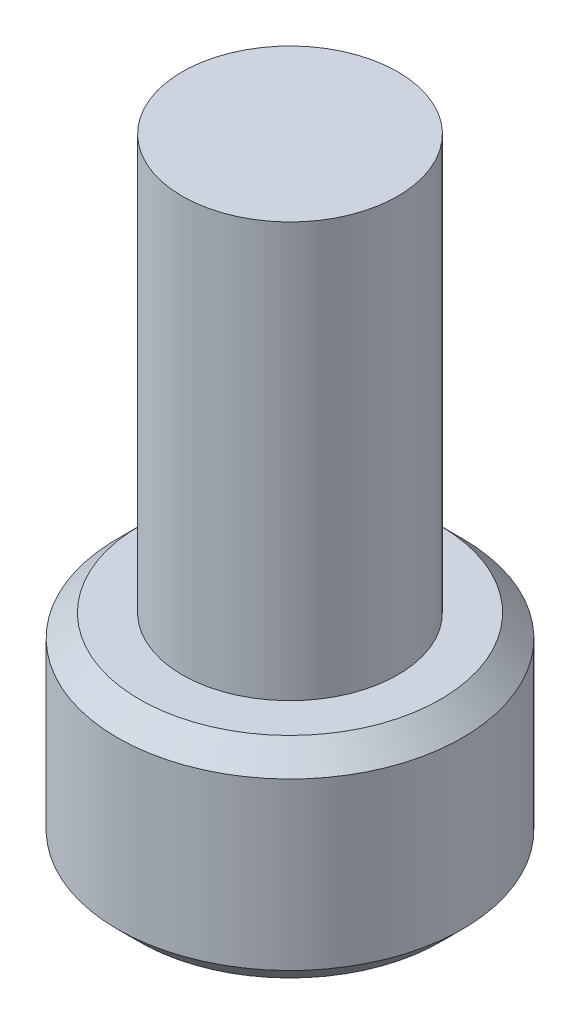
ISO-10303-21;
HEADER;
FILE_DESCRIPTION(('STEP AP214'),'2;1');
FILE_NAME('part.step','',(''),(''),'','','');
FILE_SCHEMA(('AUTOMOTIVE_DESIGN { 1 0 10303 214 1 1 1 1 }'));
ENDSEC;
DATA;
#1=APPLICATION_CONTEXT('core data for automotive mechanical design processes');
#2=APPLICATION_PROTOCOL_DEFINITION('international standard','automotive_design',2000,#1);
#3=PRODUCT_CONTEXT('',#1,'mechanical');
#4=PRODUCT('Part','Part','',(#3));
#5=PRODUCT_RELATED_PRODUCT_CATEGORY('part','',(#4));
#6=PRODUCT_DEFINITION_FORMATION('','',#4);
#7=PRODUCT_DEFINITION_CONTEXT('part definition',#1,'design');
#8=PRODUCT_DEFINITION('design','',#6,#7);
#9=PRODUCT_DEFINITION_SHAPE('','',#8);
#10=(LENGTH_UNIT() NAMED_UNIT(*) SI_UNIT(.MILLI.,.METRE.));
#11=(NAMED_UNIT(*) PLANE_ANGLE_UNIT() SI_UNIT($,.RADIAN.));
#12=(NAMED_UNIT(*) SI_UNIT($,.STERADIAN.) SOLID_ANGLE_UNIT());
#13=UNCERTAINTY_MEASURE_WITH_UNIT(LENGTH_MEASURE(1.E-05),#10,'distance_accuracy_value','');
#14=(GEOMETRIC_REPRESENTATION_CONTEXT(3) GLOBAL_UNCERTAINTY_ASSIGNED_CONTEXT((#13)) GLOBAL_UNIT_ASSIGNED_CONTEXT((#10,
#11,#12)) REPRESENTATION_CONTEXT('',''));
#15=CARTESIAN_POINT('',(0.,0.,0.));
#16=DIRECTION('',(0.,0.,1.));
#17=DIRECTION('',(1.,0.,0.));
#18=AXIS2_PLACEMENT_3D('',#15,#16,#17);
#19=CARTESIAN_POINT('',(0.,9.525,0.));
#20=DIRECTION('',(0.,-1.,0.));
#21=DIRECTION('',(0.,0.,-1.));
#22=AXIS2_PLACEMENT_3D('',#19,#20,#21);
#23=CYLINDRICAL_SURFACE('',#22,2.4765);
#24=CARTESIAN_POINT('',(0.,9.525,0.));
#25=DIRECTION('',(0.,1.,0.));
#26=DIRECTION('',(0.,0.,1.));
#27=AXIS2_PLACEMENT_3D('',#24,#25,#26);
#28=CIRCLE('',#27,2.4765);
#29=CARTESIAN_POINT('',(0.,9.525,-2.4765));
#30=VERTEX_POINT('',#29);
#31=EDGE_CURVE('E173',#30,#30,#28,.T.);
#32=CARTESIAN_POINT('',(0.,0.,0.));
#33=DIRECTION('',(0.,1.,0.));
#34=DIRECTION('',(0.,0.,1.));
#35=AXIS2_PLACEMENT_3D('',#32,#33,#34);
#36=CIRCLE('',#35,2.4765);
#37=CARTESIAN_POINT('',(0.,0.,-2.4765));
#38=VERTEX_POINT('',#37);
#39=EDGE_CURVE('E163',#38,#38,#36,.T.);
#40=CARTESIAN_POINT('',(0.,9.525,-2.4765));
#41=CARTESIAN_POINT('',(0.,9.42578125,-2.4765));
#42=CARTESIAN_POINT('',(0.,9.3265625,-2.4765));
#43=CARTESIAN_POINT('',(0.,9.128125,-2.4765));
#44=CARTESIAN_POINT('',(0.,9.02890625,-2.4765));
#45=CARTESIAN_POINT('',(0.,8.83046875,-2.4765));
#46=CARTESIAN_POINT('',(0.,8.73125,-2.4765));
#47=CARTESIAN_POINT('',(0.,8.5328125,-2.4765));
#48=CARTESIAN_POINT('',(0.,8.43359375,-2.4765));
#49=CARTESIAN_POINT('',(0.,8.23515625,-2.4765));
#50=CARTESIAN_POINT('',(0.,8.1359375,-2.4765));
#51=CARTESIAN_POINT('',(0.,7.9375,-2.4765));
#52=CARTESIAN_POINT('',(0.,7.83828125,-2.4765));
#53=CARTESIAN_POINT('',(0.,7.63984375,-2.4765));
#54=CARTESIAN_POINT('',(0.,7.540625,-2.4765));
#55=CARTESIAN_POINT('',(0.,7.3421875,-2.4765));
#56=CARTESIAN_POINT('',(0.,7.24296875,-2.4765));
#57=CARTESIAN_POINT('',(0.,7.04453125,-2.4765));
#58=CARTESIAN_POINT('',(0.,6.9453125,-2.4765));
#59=CARTESIAN_POINT('',(0.,6.746875,-2.4765));
#60=CARTESIAN_POINT('',(0.,6.64765625,-2.4765));
#61=CARTESIAN_POINT('',(0.,6.44921875,-2.4765));
#62=CARTESIAN_POINT('',(0.,6.35,-2.4765));
#63=CARTESIAN_POINT('',(0.,6.1515625,-2.4765));
#64=CARTESIAN_POINT('',(0.,6.05234375,-2.4765));
#65=CARTESIAN_POINT('',(0.,5.85390625,-2.4765));
#66=CARTESIAN_POINT('',(0.,5.7546875,-2.4765));
#67=CARTESIAN_POINT('',(0.,5.55625,-2.4765));
#68=CARTESIAN_POINT('',(0.,5.45703125,-2.4765));
#69=CARTESIAN_POINT('',(0.,5.25859375,-2.4765));
#70=CARTESIAN_POINT('',(0.,5.159375,-2.4765));
#71=CARTESIAN_POINT('',(0.,4.9609375,-2.4765));
#72=CARTESIAN_POINT('',(0.,4.86171875,-2.4765));
#73=CARTESIAN_POINT('',(0.,4.66328125,-2.4765));
#74=CARTESIAN_POINT('',(0.,4.5640625,-2.4765));
#75=CARTESIAN_POINT('',(0.,4.365625,-2.4765));
#76=CARTESIAN_POINT('',(0.,4.26640625,-2.4765));
#77=CARTESIAN_POINT('',(0.,4.06796875,-2.4765));
#78=CARTESIAN_POINT('',(0.,3.96875,-2.4765));
#79=CARTESIAN_POINT('',(0.,3.7703125,-2.4765));
#80=CARTESIAN_POINT('',(0.,3.67109375,-2.4765));
#81=CARTESIAN_POINT('',(0.,3.47265625,-2.4765));
#82=CARTESIAN_POINT('',(0.,3.3734375,-2.4765));
#83=CARTESIAN_POINT('',(0.,3.175,-2.4765));
#84=CARTESIAN_POINT('',(0.,3.07578125,-2.4765));
#85=CARTESIAN_POINT('',(0.,2.87734375,-2.4765));
#86=CARTESIAN_POINT('',(0.,2.778125,-2.4765));
#87=CARTESIAN_POINT('',(0.,2.5796875,-2.4765));
#88=CARTESIAN_POINT('',(0.,2.48046875,-2.4765));
#89=CARTESIAN_POINT('',(0.,2.28203125,-2.4765));
#90=CARTESIAN_POINT('',(0.,2.1828125,-2.4765));
#91=CARTESIAN_POINT('',(0.,1.984375,-2.4765));
#92=CARTESIAN_POINT('',(0.,1.88515625,-2.4765));
#93=CARTESIAN_POINT('',(0.,1.68671875,-2.4765));
#94=CARTESIAN_POINT('',(0.,1.5875,-2.4765));
#95=CARTESIAN_POINT('',(0.,1.3890625,-2.4765));
#96=CARTESIAN_POINT('',(0.,1.28984375,-2.4765));
#97=CARTESIAN_POINT('',(0.,1.09140625,-2.4765));
#98=CARTESIAN_POINT('',(0.,0.992187500000001,-2.4765));
#99=CARTESIAN_POINT('',(0.,0.793750000000001,-2.4765));
#100=CARTESIAN_POINT('',(0.,0.69453125,-2.4765));
#101=CARTESIAN_POINT('',(0.,0.49609375,-2.4765));
#102=CARTESIAN_POINT('',(0.,0.396875,-2.4765));
#103=CARTESIAN_POINT('',(0.,0.1984375,-2.4765));
#104=CARTESIAN_POINT('',(0.,0.0992187500000001,-2.4765));
#105=CARTESIAN_POINT('',(0.,0.,-2.4765));
#106=B_SPLINE_CURVE_WITH_KNOTS('',3,(#40,#41,#42,#43,#44,#45,#46,#47,#48,#49,#50,#51,#52,#53,
#54,#55,#56,#57,#58,#59,#60,#61,#62,#63,#64,#65,#66,#67,#68,#69,#70,#71,#72,#73,#74,#75,#76,#77,
#78,#79,#80,#81,#82,#83,#84,#85,#86,#87,#88,#89,#90,#91,#92,#93,#94,#95,#96,#97,#98,#99,#100,
#101,#102,#103,#104,#105),.UNSPECIFIED.,.F.,.F.,(4,2,2,2,2,2,2,2,2,2,2,2,2,2,2,2,2,2,2,2,2,2,2,
2,2,2,2,2,2,2,2,2,4),(0.,0.297656249999998,0.595312499999999,0.892968749999999,1.190625,
1.48828125,1.7859375,2.08359375,2.38125,2.67890625,2.9765625,3.27421875,3.571875,3.86953125,
4.1671875,4.46484375,4.7625,5.06015625,5.3578125,5.65546875,5.953125,6.25078125,6.5484375,
6.84609375,7.14375,7.44140625,7.7390625,8.03671875,8.334375,8.63203125,8.9296875,9.22734375,
9.525),.UNSPECIFIED.);
#107=EDGE_CURVE('BSEAM47',#30,#38,#106,.T.);
#108=ORIENTED_EDGE('',*,*,#31,.F.);
#109=ORIENTED_EDGE('',*,*,#39,.T.);
#110=ORIENTED_EDGE('',*,*,#107,.T.);
#111=ORIENTED_EDGE('',*,*,#107,.F.);
#112=EDGE_LOOP('',(#108,#110,#109,#111));
#113=FACE_BOUND('',#112,.T.);
#114=ADVANCED_FACE('F47',(#113),#23,.T.);
#115=CARTESIAN_POINT('',(0.,9.525,0.));
#116=DIRECTION('',(0.,1.,0.));
#117=DIRECTION('',(0.,0.,1.));
#118=AXIS2_PLACEMENT_3D('',#115,#116,#117);
#119=PLANE('',#118);
#120=ORIENTED_EDGE('',*,*,#31,.T.);
#121=EDGE_LOOP('',(#120));
#122=FACE_BOUND('',#121,.T.);
#123=ADVANCED_FACE('F203',(#122),#119,.T.);
#124=CARTESIAN_POINT('',(0.,-4.826,0.));
#125=DIRECTION('',(0.,1.,0.));
#126=DIRECTION('',(0.,0.,1.));
#127=AXIS2_PLACEMENT_3D('',#124,#125,#126);
#128=CYLINDRICAL_SURFACE('',#127,3.9624);
#129=CARTESIAN_POINT('',(0.,-0.508,0.));
#130=DIRECTION('',(0.,-1.,0.));
#131=DIRECTION('',(0.,0.,-1.));
#132=AXIS2_PLACEMENT_3D('',#129,#130,#131);
#133=CIRCLE('',#132,3.9624);
#134=CARTESIAN_POINT('',(0.,-0.508,-3.9624));
#135=VERTEX_POINT('',#134);
#136=EDGE_CURVE('E184',#135,#135,#133,.T.);
#137=ORIENTED_EDGE('',*,*,#136,.T.);
#138=EDGE_LOOP('',(#137));
#139=FACE_BOUND('',#138,.T.);
#140=CARTESIAN_POINT('',(0.,-4.318,0.));
#141=DIRECTION('',(0.,-1.,0.));
#142=DIRECTION('',(0.,0.,-1.));
#143=AXIS2_PLACEMENT_3D('',#140,#141,#142);
#144=CIRCLE('',#143,3.9624);
#145=CARTESIAN_POINT('',(0.,-4.318,-3.9624));
#146=VERTEX_POINT('',#145);
#147=EDGE_CURVE('E177',#146,#146,#144,.F.);
#148=ORIENTED_EDGE('',*,*,#147,.T.);
#149=EDGE_LOOP('',(#148));
#150=FACE_BOUND('',#149,.T.);
#151=ADVANCED_FACE('F199',(#139,#150),#128,.T.);
#152=CARTESIAN_POINT('',(0.,-4.826,0.));
#153=DIRECTION('',(0.,-1.,0.));
#154=DIRECTION('',(0.,0.,-1.));
#155=AXIS2_PLACEMENT_3D('',#152,#153,#154);
#156=PLANE('',#155);
#157=CARTESIAN_POINT('',(0.,-4.826,0.));
#158=DIRECTION('',(0.,-1.,0.));
#159=DIRECTION('',(0.,0.,-1.));
#160=AXIS2_PLACEMENT_3D('',#157,#158,#159);
#161=CIRCLE('',#160,3.4544);
#162=CARTESIAN_POINT('',(0.,-4.826,-3.4544));
#163=VERTEX_POINT('',#162);
#164=EDGE_CURVE('E11',#163,#163,#161,.T.);
#165=ORIENTED_EDGE('',*,*,#164,.T.);
#166=EDGE_LOOP('',(#165));
#167=FACE_BOUND('',#166,.T.);
#168=DIRECTION('',(0.5,0.,0.866025403784439));
#169=VECTOR('',#168,1.);
#170=CARTESIAN_POINT('',(1.14567944042316,-4.826,-1.984375));
#171=LINE('',#170,#169);
#172=CARTESIAN_POINT('',(1.14567944042316,-4.826,-1.984375));
#173=VERTEX_POINT('',#172);
#174=CARTESIAN_POINT('',(2.29135888084633,-4.826,0.));
#175=VERTEX_POINT('',#174);
#176=EDGE_CURVE('E64',#173,#175,#171,.T.);
#177=ORIENTED_EDGE('',*,*,#176,.F.);
#178=DIRECTION('',(1.,0.,0.));
#179=VECTOR('',#178,1.);
#180=CARTESIAN_POINT('',(-1.14567944042316,-4.826,-1.984375));
#181=LINE('',#180,#179);
#182=CARTESIAN_POINT('',(-1.14567944042316,-4.826,-1.984375));
#183=VERTEX_POINT('',#182);
#184=EDGE_CURVE('E157',#183,#173,#181,.T.);
#185=ORIENTED_EDGE('',*,*,#184,.F.);
#186=DIRECTION('',(0.5,0.,-0.866025403784439));
#187=VECTOR('',#186,1.);
#188=CARTESIAN_POINT('',(-2.29135888084633,-4.826,0.));
#189=LINE('',#188,#187);
#190=CARTESIAN_POINT('',(-2.29135888084633,-4.826,0.));
#191=VERTEX_POINT('',#190);
#192=EDGE_CURVE('E154',#191,#183,#189,.T.);
#193=ORIENTED_EDGE('',*,*,#192,.F.);
#194=DIRECTION('',(-0.5,0.,-0.866025403784439));
#195=VECTOR('',#194,1.);
#196=CARTESIAN_POINT('',(-1.14567944042316,-4.826,1.984375));
#197=LINE('',#196,#195);
#198=CARTESIAN_POINT('',(-1.14567944042316,-4.826,1.984375));
#199=VERTEX_POINT('',#198);
#200=EDGE_CURVE('E112',#199,#191,#197,.T.);
#201=ORIENTED_EDGE('',*,*,#200,.F.);
#202=DIRECTION('',(-1.,0.,0.));
#203=VECTOR('',#202,1.);
#204=CARTESIAN_POINT('',(1.14567944042316,-4.826,1.984375));
#205=LINE('',#204,#203);
#206=CARTESIAN_POINT('',(1.14567944042316,-4.826,1.984375));
#207=VERTEX_POINT('',#206);
#208=EDGE_CURVE('E148',#207,#199,#205,.T.);
#209=ORIENTED_EDGE('',*,*,#208,.F.);
#210=DIRECTION('',(-0.5,0.,0.866025403784439));
#211=VECTOR('',#210,1.);
#212=CARTESIAN_POINT('',(2.29135888084633,-4.826,0.));
#213=LINE('',#212,#211);
#214=EDGE_CURVE('E144',#175,#207,#213,.T.);
#215=ORIENTED_EDGE('',*,*,#214,.F.);
#216=EDGE_LOOP('',(#177,#185,#193,#201,#209,#215));
#217=FACE_BOUND('',#216,.T.);
#218=ADVANCED_FACE('F202',(#167,#217),#156,.T.);
#219=CARTESIAN_POINT('',(0.,0.,0.));
#220=DIRECTION('',(0.,-1.,0.));
#221=DIRECTION('',(0.,0.,-1.));
#222=AXIS2_PLACEMENT_3D('',#219,#220,#221);
#223=PLANE('',#222);
#224=CARTESIAN_POINT('',(0.,0.,0.));
#225=DIRECTION('',(0.,-1.,0.));
#226=DIRECTION('',(0.,0.,-1.));
#227=AXIS2_PLACEMENT_3D('',#224,#225,#226);
#228=CIRCLE('',#227,3.4544);
#229=CARTESIAN_POINT('',(0.,0.,-3.4544));
#230=VERTEX_POINT('',#229);
#231=EDGE_CURVE('E57',#230,#230,#228,.F.);
#232=ORIENTED_EDGE('',*,*,#231,.T.);
#233=EDGE_LOOP('',(#232));
#234=FACE_BOUND('',#233,.T.);
#235=ORIENTED_EDGE('',*,*,#39,.F.);
#236=EDGE_LOOP('',(#235));
#237=FACE_BOUND('',#236,.T.);
#238=ADVANCED_FACE('F191',(#234,#237),#223,.F.);
#239=CARTESIAN_POINT('',(1.14567944042316,-2.54,-1.984375));
#240=DIRECTION('',(0.866025403784439,0.,-0.5));
#241=DIRECTION('',(-0.5,0.,-0.866025403784439));
#242=AXIS2_PLACEMENT_3D('',#239,#240,#241);
#243=PLANE('',#242);
#244=ORIENTED_EDGE('',*,*,#176,.T.);
#245=DIRECTION('',(0.,-1.,0.));
#246=VECTOR('',#245,1.);
#247=CARTESIAN_POINT('',(2.29135888084633,-2.54,0.));
#248=LINE('',#247,#246);
#249=CARTESIAN_POINT('',(2.29135888084633,-2.54,0.));
#250=VERTEX_POINT('',#249);
#251=EDGE_CURVE('E94',#250,#175,#248,.T.);
#252=ORIENTED_EDGE('',*,*,#251,.F.);
#253=DIRECTION('',(0.5,0.,0.866025403784439));
#254=VECTOR('',#253,1.);
#255=CARTESIAN_POINT('',(1.14567944042316,-2.54,-1.984375));
#256=LINE('',#255,#254);
#257=CARTESIAN_POINT('',(1.14567944042316,-2.54,-1.984375));
#258=VERTEX_POINT('',#257);
#259=EDGE_CURVE('E160',#258,#250,#256,.T.);
#260=ORIENTED_EDGE('',*,*,#259,.F.);
#261=DIRECTION('',(0.,-1.,0.));
#262=VECTOR('',#261,1.);
#263=CARTESIAN_POINT('',(1.14567944042316,-2.54,-1.984375));
#264=LINE('',#263,#262);
#265=EDGE_CURVE('E72',#258,#173,#264,.T.);
#266=ORIENTED_EDGE('',*,*,#265,.T.);
#267=EDGE_LOOP('',(#244,#252,#260,#266));
#268=FACE_BOUND('',#267,.T.);
#269=ADVANCED_FACE('F222',(#268),#243,.F.);
#270=CARTESIAN_POINT('',(-1.14567944042316,-2.54,-1.984375));
#271=DIRECTION('',(0.,0.,-1.));
#272=DIRECTION('',(-1.,0.,0.));
#273=AXIS2_PLACEMENT_3D('',#270,#271,#272);
#274=PLANE('',#273);
#275=ORIENTED_EDGE('',*,*,#184,.T.);
#276=ORIENTED_EDGE('',*,*,#265,.F.);
#277=DIRECTION('',(1.,0.,0.));
#278=VECTOR('',#277,1.);
#279=CARTESIAN_POINT('',(-1.14567944042316,-2.54,-1.984375));
#280=LINE('',#279,#278);
#281=CARTESIAN_POINT('',(-1.14567944042316,-2.54,-1.984375));
#282=VERTEX_POINT('',#281);
#283=EDGE_CURVE('E126',#282,#258,#280,.T.);
#284=ORIENTED_EDGE('',*,*,#283,.F.);
#285=DIRECTION('',(0.,-1.,0.));
#286=VECTOR('',#285,1.);
#287=CARTESIAN_POINT('',(-1.14567944042316,-2.54,-1.984375));
#288=LINE('',#287,#286);
#289=EDGE_CURVE('E117',#282,#183,#288,.T.);
#290=ORIENTED_EDGE('',*,*,#289,.T.);
#291=EDGE_LOOP('',(#275,#276,#284,#290));
#292=FACE_BOUND('',#291,.T.);
#293=ADVANCED_FACE('F224',(#292),#274,.F.);
#294=CARTESIAN_POINT('',(-2.29135888084633,-2.54,0.));
#295=DIRECTION('',(-0.866025403784439,0.,-0.5));
#296=DIRECTION('',(-0.5,0.,0.866025403784439));
#297=AXIS2_PLACEMENT_3D('',#294,#295,#296);
#298=PLANE('',#297);
#299=ORIENTED_EDGE('',*,*,#192,.T.);
#300=ORIENTED_EDGE('',*,*,#289,.F.);
#301=DIRECTION('',(0.5,0.,-0.866025403784439));
#302=VECTOR('',#301,1.);
#303=CARTESIAN_POINT('',(-2.29135888084633,-2.54,0.));
#304=LINE('',#303,#302);
#305=CARTESIAN_POINT('',(-2.29135888084633,-2.54,0.));
#306=VERTEX_POINT('',#305);
#307=EDGE_CURVE('E121',#306,#282,#304,.T.);
#308=ORIENTED_EDGE('',*,*,#307,.F.);
#309=DIRECTION('',(0.,-1.,0.));
#310=VECTOR('',#309,1.);
#311=CARTESIAN_POINT('',(-2.29135888084633,-2.54,0.));
#312=LINE('',#311,#310);
#313=EDGE_CURVE('E105',#306,#191,#312,.T.);
#314=ORIENTED_EDGE('',*,*,#313,.T.);
#315=EDGE_LOOP('',(#299,#300,#308,#314));
#316=FACE_BOUND('',#315,.T.);
#317=ADVANCED_FACE('F122',(#316),#298,.F.);
#318=CARTESIAN_POINT('',(-1.14567944042316,-2.54,1.984375));
#319=DIRECTION('',(-0.866025403784439,0.,0.5));
#320=DIRECTION('',(0.5,0.,0.866025403784439));
#321=AXIS2_PLACEMENT_3D('',#318,#319,#320);
#322=PLANE('',#321);
#323=ORIENTED_EDGE('',*,*,#200,.T.);
#324=ORIENTED_EDGE('',*,*,#313,.F.);
#325=DIRECTION('',(-0.5,0.,-0.866025403784439));
#326=VECTOR('',#325,1.);
#327=CARTESIAN_POINT('',(-1.14567944042316,-2.54,1.984375));
#328=LINE('',#327,#326);
#329=CARTESIAN_POINT('',(-1.14567944042316,-2.54,1.984375));
#330=VERTEX_POINT('',#329);
#331=EDGE_CURVE('E109',#330,#306,#328,.T.);
#332=ORIENTED_EDGE('',*,*,#331,.F.);
#333=DIRECTION('',(0.,-1.,0.));
#334=VECTOR('',#333,1.);
#335=CARTESIAN_POINT('',(-1.14567944042316,-2.54,1.984375));
#336=LINE('',#335,#334);
#337=EDGE_CURVE('E118',#330,#199,#336,.T.);
#338=ORIENTED_EDGE('',*,*,#337,.T.);
#339=EDGE_LOOP('',(#323,#324,#332,#338));
#340=FACE_BOUND('',#339,.T.);
#341=ADVANCED_FACE('F107',(#340),#322,.F.);
#342=CARTESIAN_POINT('',(1.14567944042316,-2.54,1.984375));
#343=DIRECTION('',(0.,0.,1.));
#344=DIRECTION('',(1.,0.,0.));
#345=AXIS2_PLACEMENT_3D('',#342,#343,#344);
#346=PLANE('',#345);
#347=ORIENTED_EDGE('',*,*,#208,.T.);
#348=ORIENTED_EDGE('',*,*,#337,.F.);
#349=DIRECTION('',(-1.,0.,0.));
#350=VECTOR('',#349,1.);
#351=CARTESIAN_POINT('',(1.14567944042316,-2.54,1.984375));
#352=LINE('',#351,#350);
#353=CARTESIAN_POINT('',(1.14567944042316,-2.54,1.984375));
#354=VERTEX_POINT('',#353);
#355=EDGE_CURVE('E132',#354,#330,#352,.T.);
#356=ORIENTED_EDGE('',*,*,#355,.F.);
#357=DIRECTION('',(0.,-1.,0.));
#358=VECTOR('',#357,1.);
#359=CARTESIAN_POINT('',(1.14567944042316,-2.54,1.984375));
#360=LINE('',#359,#358);
#361=EDGE_CURVE('E168',#354,#207,#360,.T.);
#362=ORIENTED_EDGE('',*,*,#361,.T.);
#363=EDGE_LOOP('',(#347,#348,#356,#362));
#364=FACE_BOUND('',#363,.T.);
#365=ADVANCED_FACE('F301',(#364),#346,.F.);
#366=CARTESIAN_POINT('',(2.29135888084633,-2.54,0.));
#367=DIRECTION('',(0.866025403784439,0.,0.5));
#368=DIRECTION('',(0.5,0.,-0.866025403784439));
#369=AXIS2_PLACEMENT_3D('',#366,#367,#368);
#370=PLANE('',#369);
#371=ORIENTED_EDGE('',*,*,#214,.T.);
#372=ORIENTED_EDGE('',*,*,#361,.F.);
#373=DIRECTION('',(-0.5,0.,0.866025403784439));
#374=VECTOR('',#373,1.);
#375=CARTESIAN_POINT('',(2.29135888084633,-2.54,0.));
#376=LINE('',#375,#374);
#377=EDGE_CURVE('E136',#250,#354,#376,.T.);
#378=ORIENTED_EDGE('',*,*,#377,.F.);
#379=ORIENTED_EDGE('',*,*,#251,.T.);
#380=EDGE_LOOP('',(#371,#372,#378,#379));
#381=FACE_BOUND('',#380,.T.);
#382=ADVANCED_FACE('F218',(#381),#370,.F.);
#383=CARTESIAN_POINT('',(0.,-2.54,0.));
#384=DIRECTION('',(0.,-1.,0.));
#385=DIRECTION('',(0.,0.,-1.));
#386=AXIS2_PLACEMENT_3D('',#383,#384,#385);
#387=PLANE('',#386);
#388=ORIENTED_EDGE('',*,*,#259,.T.);
#389=ORIENTED_EDGE('',*,*,#377,.T.);
#390=ORIENTED_EDGE('',*,*,#355,.T.);
#391=ORIENTED_EDGE('',*,*,#331,.T.);
#392=ORIENTED_EDGE('',*,*,#307,.T.);
#393=ORIENTED_EDGE('',*,*,#283,.T.);
#394=EDGE_LOOP('',(#388,#389,#390,#391,#392,#393));
#395=FACE_BOUND('',#394,.T.);
#396=ADVANCED_FACE('F129',(#395),#387,.T.);
#397=CARTESIAN_POINT('',(0.,-0.508,0.));
#398=DIRECTION('',(0.,-1.,0.));
#399=DIRECTION('',(0.,0.,-1.));
#400=AXIS2_PLACEMENT_3D('',#397,#398,#399);
#401=CONICAL_SURFACE('',#400,3.9624,0.78539816339745);
#402=ORIENTED_EDGE('',*,*,#231,.F.);
#403=EDGE_LOOP('',(#402));
#404=FACE_BOUND('',#403,.T.);
#405=ORIENTED_EDGE('',*,*,#136,.F.);
#406=EDGE_LOOP('',(#405));
#407=FACE_BOUND('',#406,.T.);
#408=ADVANCED_FACE('F194',(#404,#407),#401,.T.);
#409=CARTESIAN_POINT('',(0.,-4.826,0.));
#410=DIRECTION('',(0.,1.,0.));
#411=DIRECTION('',(0.,0.,1.));
#412=AXIS2_PLACEMENT_3D('',#409,#410,#411);
#413=CONICAL_SURFACE('',#412,3.4544,0.785398163397447);
#414=ORIENTED_EDGE('',*,*,#147,.F.);
#415=EDGE_LOOP('',(#414));
#416=FACE_BOUND('',#415,.T.);
#417=ORIENTED_EDGE('',*,*,#164,.F.);
#418=EDGE_LOOP('',(#417));
#419=FACE_BOUND('',#418,.T.);
#420=ADVANCED_FACE('F50',(#416,#419),#413,.T.);
#421=CLOSED_SHELL('',(#114,#123,#151,#218,#238,#269,#293,#317,#341,#365,#382,#396,#408,#420));
#422=MANIFOLD_SOLID_BREP('B2',#421);
#423=ADVANCED_BREP_SHAPE_REPRESENTATION('',(#18,#422),#14);
#424=SHAPE_DEFINITION_REPRESENTATION(#9,#423);
ENDSEC;
END-ISO-10303-21;
